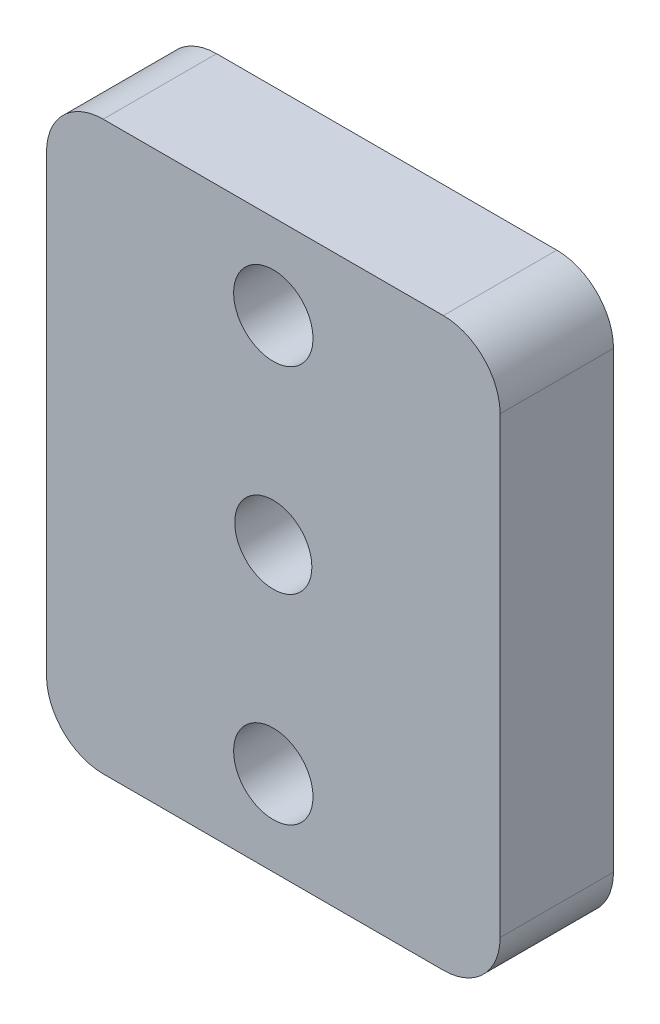
ISO-10303-21;
HEADER;
FILE_DESCRIPTION(('STEP AP214'),'2;1');
FILE_NAME('part.step','',(''),(''),'','','');
FILE_SCHEMA(('AUTOMOTIVE_DESIGN { 1 0 10303 214 1 1 1 1 }'));
ENDSEC;
DATA;
#1=APPLICATION_CONTEXT('core data for automotive mechanical design processes');
#2=APPLICATION_PROTOCOL_DEFINITION('international standard','automotive_design',2000,#1);
#3=PRODUCT_CONTEXT('',#1,'mechanical');
#4=PRODUCT('Part','Part','',(#3));
#5=PRODUCT_RELATED_PRODUCT_CATEGORY('part','',(#4));
#6=PRODUCT_DEFINITION_FORMATION('','',#4);
#7=PRODUCT_DEFINITION_CONTEXT('part definition',#1,'design');
#8=PRODUCT_DEFINITION('design','',#6,#7);
#9=PRODUCT_DEFINITION_SHAPE('','',#8);
#10=(LENGTH_UNIT() NAMED_UNIT(*) SI_UNIT(.MILLI.,.METRE.));
#11=(NAMED_UNIT(*) PLANE_ANGLE_UNIT() SI_UNIT($,.RADIAN.));
#12=(NAMED_UNIT(*) SI_UNIT($,.STERADIAN.) SOLID_ANGLE_UNIT());
#13=UNCERTAINTY_MEASURE_WITH_UNIT(LENGTH_MEASURE(1.E-05),#10,'distance_accuracy_value','');
#14=(GEOMETRIC_REPRESENTATION_CONTEXT(3) GLOBAL_UNCERTAINTY_ASSIGNED_CONTEXT((#13)) GLOBAL_UNIT_ASSIGNED_CONTEXT((#10,
#11,#12)) REPRESENTATION_CONTEXT('',''));
#15=CARTESIAN_POINT('',(0.,0.,0.));
#16=DIRECTION('',(0.,0.,1.));
#17=DIRECTION('',(1.,0.,0.));
#18=AXIS2_PLACEMENT_3D('',#15,#16,#17);
#19=CARTESIAN_POINT('',(0.,0.,10.));
#20=DIRECTION('',(1.,0.,0.));
#21=DIRECTION('',(0.,0.,-1.));
#22=AXIS2_PLACEMENT_3D('',#19,#20,#21);
#23=PLANE('',#22);
#24=DIRECTION('',(0.,-1.,0.));
#25=VECTOR('',#24,1.);
#26=CARTESIAN_POINT('',(0.,0.,0.));
#27=LINE('',#26,#25);
#28=CARTESIAN_POINT('',(0.,45.,0.));
#29=VERTEX_POINT('',#28);
#30=CARTESIAN_POINT('',(0.,5.,0.));
#31=VERTEX_POINT('',#30);
#32=EDGE_CURVE('E126',#29,#31,#27,.T.);
#33=ORIENTED_EDGE('',*,*,#32,.T.);
#34=DIRECTION('',(0.,0.,-1.));
#35=VECTOR('',#34,1.);
#36=CARTESIAN_POINT('',(0.,5.,10.));
#37=LINE('',#36,#35);
#38=CARTESIAN_POINT('',(0.,5.,10.));
#39=VERTEX_POINT('',#38);
#40=EDGE_CURVE('E104',#31,#39,#37,.F.);
#41=ORIENTED_EDGE('',*,*,#40,.T.);
#42=DIRECTION('',(0.,-1.,0.));
#43=VECTOR('',#42,1.);
#44=CARTESIAN_POINT('',(0.,0.,10.));
#45=LINE('',#44,#43);
#46=CARTESIAN_POINT('',(0.,45.,10.));
#47=VERTEX_POINT('',#46);
#48=EDGE_CURVE('E136',#47,#39,#45,.T.);
#49=ORIENTED_EDGE('',*,*,#48,.F.);
#50=DIRECTION('',(0.,0.,-1.));
#51=VECTOR('',#50,1.);
#52=CARTESIAN_POINT('',(0.,45.,10.));
#53=LINE('',#52,#51);
#54=EDGE_CURVE('E109',#47,#29,#53,.T.);
#55=ORIENTED_EDGE('',*,*,#54,.T.);
#56=EDGE_LOOP('',(#33,#41,#49,#55));
#57=FACE_BOUND('',#56,.T.);
#58=ADVANCED_FACE('F33',(#57),#23,.F.);
#59=CARTESIAN_POINT('',(0.,0.,10.));
#60=DIRECTION('',(0.,1.,0.));
#61=DIRECTION('',(0.,0.,1.));
#62=AXIS2_PLACEMENT_3D('',#59,#60,#61);
#63=PLANE('',#62);
#64=DIRECTION('',(1.,0.,0.));
#65=VECTOR('',#64,1.);
#66=CARTESIAN_POINT('',(0.,0.,10.));
#67=LINE('',#66,#65);
#68=CARTESIAN_POINT('',(5.,0.,10.));
#69=VERTEX_POINT('',#68);
#70=CARTESIAN_POINT('',(35.,0.,10.));
#71=VERTEX_POINT('',#70);
#72=EDGE_CURVE('E119',#69,#71,#67,.T.);
#73=ORIENTED_EDGE('',*,*,#72,.F.);
#74=DIRECTION('',(0.,0.,-1.));
#75=VECTOR('',#74,1.);
#76=CARTESIAN_POINT('',(5.,0.,10.));
#77=LINE('',#76,#75);
#78=CARTESIAN_POINT('',(5.,0.,0.));
#79=VERTEX_POINT('',#78);
#80=EDGE_CURVE('E103',#69,#79,#77,.T.);
#81=ORIENTED_EDGE('',*,*,#80,.T.);
#82=DIRECTION('',(1.,0.,0.));
#83=VECTOR('',#82,1.);
#84=CARTESIAN_POINT('',(0.,0.,0.));
#85=LINE('',#84,#83);
#86=CARTESIAN_POINT('',(35.,0.,0.));
#87=VERTEX_POINT('',#86);
#88=EDGE_CURVE('E116',#79,#87,#85,.T.);
#89=ORIENTED_EDGE('',*,*,#88,.T.);
#90=DIRECTION('',(0.,0.,-1.));
#91=VECTOR('',#90,1.);
#92=CARTESIAN_POINT('',(35.,0.,10.));
#93=LINE('',#92,#91);
#94=EDGE_CURVE('E121',#87,#71,#93,.F.);
#95=ORIENTED_EDGE('',*,*,#94,.T.);
#96=EDGE_LOOP('',(#73,#81,#89,#95));
#97=FACE_BOUND('',#96,.T.);
#98=ADVANCED_FACE('F115',(#97),#63,.F.);
#99=CARTESIAN_POINT('',(40.,0.,10.));
#100=DIRECTION('',(-1.,0.,0.));
#101=DIRECTION('',(0.,0.,1.));
#102=AXIS2_PLACEMENT_3D('',#99,#100,#101);
#103=PLANE('',#102);
#104=DIRECTION('',(0.,1.,0.));
#105=VECTOR('',#104,1.);
#106=CARTESIAN_POINT('',(40.,0.,10.));
#107=LINE('',#106,#105);
#108=CARTESIAN_POINT('',(40.,5.,10.));
#109=VERTEX_POINT('',#108);
#110=CARTESIAN_POINT('',(40.,45.,10.));
#111=VERTEX_POINT('',#110);
#112=EDGE_CURVE('E162',#109,#111,#107,.T.);
#113=ORIENTED_EDGE('',*,*,#112,.F.);
#114=DIRECTION('',(0.,0.,-1.));
#115=VECTOR('',#114,1.);
#116=CARTESIAN_POINT('',(40.,5.,10.));
#117=LINE('',#116,#115);
#118=CARTESIAN_POINT('',(40.,5.,0.));
#119=VERTEX_POINT('',#118);
#120=EDGE_CURVE('E155',#109,#119,#117,.T.);
#121=ORIENTED_EDGE('',*,*,#120,.T.);
#122=DIRECTION('',(0.,1.,0.));
#123=VECTOR('',#122,1.);
#124=CARTESIAN_POINT('',(40.,0.,0.));
#125=LINE('',#124,#123);
#126=CARTESIAN_POINT('',(40.,45.,0.));
#127=VERTEX_POINT('',#126);
#128=EDGE_CURVE('E125',#119,#127,#125,.T.);
#129=ORIENTED_EDGE('',*,*,#128,.T.);
#130=DIRECTION('',(0.,0.,-1.));
#131=VECTOR('',#130,1.);
#132=CARTESIAN_POINT('',(40.,45.,10.));
#133=LINE('',#132,#131);
#134=EDGE_CURVE('E153',#127,#111,#133,.F.);
#135=ORIENTED_EDGE('',*,*,#134,.T.);
#136=EDGE_LOOP('',(#113,#121,#129,#135));
#137=FACE_BOUND('',#136,.T.);
#138=ADVANCED_FACE('F160',(#137),#103,.F.);
#139=CARTESIAN_POINT('',(0.,50.,10.));
#140=DIRECTION('',(0.,-1.,0.));
#141=DIRECTION('',(0.,0.,-1.));
#142=AXIS2_PLACEMENT_3D('',#139,#140,#141);
#143=PLANE('',#142);
#144=DIRECTION('',(-1.,0.,0.));
#145=VECTOR('',#144,1.);
#146=CARTESIAN_POINT('',(0.,50.,10.));
#147=LINE('',#146,#145);
#148=CARTESIAN_POINT('',(35.,50.,10.));
#149=VERTEX_POINT('',#148);
#150=CARTESIAN_POINT('',(5.,50.,10.));
#151=VERTEX_POINT('',#150);
#152=EDGE_CURVE('E137',#149,#151,#147,.T.);
#153=ORIENTED_EDGE('',*,*,#152,.F.);
#154=DIRECTION('',(0.,0.,-1.));
#155=VECTOR('',#154,1.);
#156=CARTESIAN_POINT('',(35.,50.,10.));
#157=LINE('',#156,#155);
#158=CARTESIAN_POINT('',(35.,50.,0.));
#159=VERTEX_POINT('',#158);
#160=EDGE_CURVE('E11',#149,#159,#157,.T.);
#161=ORIENTED_EDGE('',*,*,#160,.T.);
#162=DIRECTION('',(-1.,0.,0.));
#163=VECTOR('',#162,1.);
#164=CARTESIAN_POINT('',(0.,50.,0.));
#165=LINE('',#164,#163);
#166=CARTESIAN_POINT('',(5.,50.,0.));
#167=VERTEX_POINT('',#166);
#168=EDGE_CURVE('E129',#159,#167,#165,.T.);
#169=ORIENTED_EDGE('',*,*,#168,.T.);
#170=DIRECTION('',(0.,0.,-1.));
#171=VECTOR('',#170,1.);
#172=CARTESIAN_POINT('',(5.,50.,10.));
#173=LINE('',#172,#171);
#174=EDGE_CURVE('E41',#167,#151,#173,.F.);
#175=ORIENTED_EDGE('',*,*,#174,.T.);
#176=EDGE_LOOP('',(#153,#161,#169,#175));
#177=FACE_BOUND('',#176,.T.);
#178=ADVANCED_FACE('F169',(#177),#143,.F.);
#179=CARTESIAN_POINT('',(0.,0.,10.));
#180=DIRECTION('',(0.,0.,-1.));
#181=DIRECTION('',(-1.,0.,0.));
#182=AXIS2_PLACEMENT_3D('',#179,#180,#181);
#183=PLANE('',#182);
#184=CARTESIAN_POINT('',(20.,7.5,10.));
#185=DIRECTION('',(0.,0.,-1.));
#186=DIRECTION('',(-1.,0.,0.));
#187=AXIS2_PLACEMENT_3D('',#184,#185,#186);
#188=CIRCLE('',#187,3.5);
#189=CARTESIAN_POINT('',(16.5,7.5,10.));
#190=VERTEX_POINT('',#189);
#191=EDGE_CURVE('E181',#190,#190,#188,.T.);
#192=ORIENTED_EDGE('',*,*,#191,.T.);
#193=EDGE_LOOP('',(#192));
#194=FACE_BOUND('',#193,.T.);
#195=CARTESIAN_POINT('',(20.,42.5,10.));
#196=DIRECTION('',(0.,0.,-1.));
#197=DIRECTION('',(-1.,0.,0.));
#198=AXIS2_PLACEMENT_3D('',#195,#196,#197);
#199=CIRCLE('',#198,3.5);
#200=CARTESIAN_POINT('',(16.5,42.5,10.));
#201=VERTEX_POINT('',#200);
#202=EDGE_CURVE('E184',#201,#201,#199,.T.);
#203=ORIENTED_EDGE('',*,*,#202,.T.);
#204=EDGE_LOOP('',(#203));
#205=FACE_BOUND('',#204,.T.);
#206=CARTESIAN_POINT('',(20.,25.,10.));
#207=DIRECTION('',(0.,0.,-1.));
#208=DIRECTION('',(-1.,0.,0.));
#209=AXIS2_PLACEMENT_3D('',#206,#207,#208);
#210=CIRCLE('',#209,3.4);
#211=CARTESIAN_POINT('',(16.6,25.,10.));
#212=VERTEX_POINT('',#211);
#213=EDGE_CURVE('E131',#212,#212,#210,.T.);
#214=ORIENTED_EDGE('',*,*,#213,.T.);
#215=EDGE_LOOP('',(#214));
#216=FACE_BOUND('',#215,.T.);
#217=ORIENTED_EDGE('',*,*,#48,.T.);
#218=CARTESIAN_POINT('',(5.,5.,10.));
#219=DIRECTION('',(0.,0.,-1.));
#220=DIRECTION('',(-1.,0.,0.));
#221=AXIS2_PLACEMENT_3D('',#218,#219,#220);
#222=CIRCLE('',#221,5.);
#223=EDGE_CURVE('E151',#39,#69,#222,.F.);
#224=ORIENTED_EDGE('',*,*,#223,.T.);
#225=ORIENTED_EDGE('',*,*,#72,.T.);
#226=CARTESIAN_POINT('',(35.,5.,10.));
#227=DIRECTION('',(0.,0.,-1.));
#228=DIRECTION('',(-1.,0.,0.));
#229=AXIS2_PLACEMENT_3D('',#226,#227,#228);
#230=CIRCLE('',#229,5.);
#231=EDGE_CURVE('E149',#71,#109,#230,.F.);
#232=ORIENTED_EDGE('',*,*,#231,.T.);
#233=ORIENTED_EDGE('',*,*,#112,.T.);
#234=CARTESIAN_POINT('',(35.,45.,10.));
#235=DIRECTION('',(0.,0.,-1.));
#236=DIRECTION('',(-1.,0.,0.));
#237=AXIS2_PLACEMENT_3D('',#234,#235,#236);
#238=CIRCLE('',#237,5.);
#239=EDGE_CURVE('E54',#111,#149,#238,.F.);
#240=ORIENTED_EDGE('',*,*,#239,.T.);
#241=ORIENTED_EDGE('',*,*,#152,.T.);
#242=CARTESIAN_POINT('',(5.,45.,10.));
#243=DIRECTION('',(0.,0.,-1.));
#244=DIRECTION('',(-1.,0.,0.));
#245=AXIS2_PLACEMENT_3D('',#242,#243,#244);
#246=CIRCLE('',#245,5.);
#247=EDGE_CURVE('E146',#151,#47,#246,.F.);
#248=ORIENTED_EDGE('',*,*,#247,.T.);
#249=EDGE_LOOP('',(#217,#224,#225,#232,#233,#240,#241,#248));
#250=FACE_BOUND('',#249,.T.);
#251=ADVANCED_FACE('F203',(#194,#205,#216,#250),#183,.F.);
#252=CARTESIAN_POINT('',(0.,0.,0.));
#253=DIRECTION('',(0.,0.,-1.));
#254=DIRECTION('',(-1.,0.,0.));
#255=AXIS2_PLACEMENT_3D('',#252,#253,#254);
#256=PLANE('',#255);
#257=CARTESIAN_POINT('',(20.,7.5,0.));
#258=DIRECTION('',(0.,0.,1.));
#259=DIRECTION('',(1.,0.,0.));
#260=AXIS2_PLACEMENT_3D('',#257,#258,#259);
#261=CIRCLE('',#260,3.5);
#262=CARTESIAN_POINT('',(23.5,7.5,0.));
#263=VERTEX_POINT('',#262);
#264=EDGE_CURVE('E187',#263,#263,#261,.T.);
#265=ORIENTED_EDGE('',*,*,#264,.T.);
#266=EDGE_LOOP('',(#265));
#267=FACE_BOUND('',#266,.T.);
#268=CARTESIAN_POINT('',(20.,42.5,0.));
#269=DIRECTION('',(0.,0.,1.));
#270=DIRECTION('',(-1.,0.,0.));
#271=AXIS2_PLACEMENT_3D('',#268,#269,#270);
#272=CIRCLE('',#271,3.5);
#273=CARTESIAN_POINT('',(16.5,42.5,0.));
#274=VERTEX_POINT('',#273);
#275=EDGE_CURVE('E188',#274,#274,#272,.T.);
#276=ORIENTED_EDGE('',*,*,#275,.T.);
#277=EDGE_LOOP('',(#276));
#278=FACE_BOUND('',#277,.T.);
#279=CARTESIAN_POINT('',(20.,25.,0.));
#280=DIRECTION('',(0.,0.,1.));
#281=DIRECTION('',(1.,0.,0.));
#282=AXIS2_PLACEMENT_3D('',#279,#280,#281);
#283=CIRCLE('',#282,3.4);
#284=CARTESIAN_POINT('',(23.4,25.,0.));
#285=VERTEX_POINT('',#284);
#286=EDGE_CURVE('E178',#285,#285,#283,.T.);
#287=ORIENTED_EDGE('',*,*,#286,.T.);
#288=EDGE_LOOP('',(#287));
#289=FACE_BOUND('',#288,.T.);
#290=ORIENTED_EDGE('',*,*,#88,.F.);
#291=CARTESIAN_POINT('',(5.,5.,0.));
#292=DIRECTION('',(0.,0.,-1.));
#293=DIRECTION('',(-1.,0.,0.));
#294=AXIS2_PLACEMENT_3D('',#291,#292,#293);
#295=CIRCLE('',#294,5.);
#296=EDGE_CURVE('E99',#79,#31,#295,.T.);
#297=ORIENTED_EDGE('',*,*,#296,.T.);
#298=ORIENTED_EDGE('',*,*,#32,.F.);
#299=CARTESIAN_POINT('',(5.,45.,0.));
#300=DIRECTION('',(0.,0.,-1.));
#301=DIRECTION('',(-1.,0.,0.));
#302=AXIS2_PLACEMENT_3D('',#299,#300,#301);
#303=CIRCLE('',#302,5.);
#304=EDGE_CURVE('E120',#29,#167,#303,.T.);
#305=ORIENTED_EDGE('',*,*,#304,.T.);
#306=ORIENTED_EDGE('',*,*,#168,.F.);
#307=CARTESIAN_POINT('',(35.,45.,0.));
#308=DIRECTION('',(0.,0.,-1.));
#309=DIRECTION('',(-1.,0.,0.));
#310=AXIS2_PLACEMENT_3D('',#307,#308,#309);
#311=CIRCLE('',#310,5.);
#312=EDGE_CURVE('E140',#159,#127,#311,.T.);
#313=ORIENTED_EDGE('',*,*,#312,.T.);
#314=ORIENTED_EDGE('',*,*,#128,.F.);
#315=CARTESIAN_POINT('',(35.,5.,0.));
#316=DIRECTION('',(0.,0.,-1.));
#317=DIRECTION('',(-1.,0.,0.));
#318=AXIS2_PLACEMENT_3D('',#315,#316,#317);
#319=CIRCLE('',#318,5.);
#320=EDGE_CURVE('E110',#119,#87,#319,.T.);
#321=ORIENTED_EDGE('',*,*,#320,.T.);
#322=EDGE_LOOP('',(#290,#297,#298,#305,#306,#313,#314,#321));
#323=FACE_BOUND('',#322,.T.);
#324=ADVANCED_FACE('F123',(#267,#278,#289,#323),#256,.T.);
#325=CARTESIAN_POINT('',(20.,25.,0.));
#326=DIRECTION('',(0.,0.,1.));
#327=DIRECTION('',(1.,0.,0.));
#328=AXIS2_PLACEMENT_3D('',#325,#326,#327);
#329=CYLINDRICAL_SURFACE('',#328,3.4);
#330=ORIENTED_EDGE('',*,*,#286,.F.);
#331=EDGE_LOOP('',(#330));
#332=FACE_BOUND('',#331,.T.);
#333=ORIENTED_EDGE('',*,*,#213,.F.);
#334=EDGE_LOOP('',(#333));
#335=FACE_BOUND('',#334,.T.);
#336=ADVANCED_FACE('F264',(#332,#335),#329,.F.);
#337=CARTESIAN_POINT('',(20.,42.5,0.));
#338=DIRECTION('',(0.,0.,1.));
#339=DIRECTION('',(1.,0.,0.));
#340=AXIS2_PLACEMENT_3D('',#337,#338,#339);
#341=CYLINDRICAL_SURFACE('',#340,3.5);
#342=ORIENTED_EDGE('',*,*,#275,.F.);
#343=EDGE_LOOP('',(#342));
#344=FACE_BOUND('',#343,.T.);
#345=ORIENTED_EDGE('',*,*,#202,.F.);
#346=EDGE_LOOP('',(#345));
#347=FACE_BOUND('',#346,.T.);
#348=ADVANCED_FACE('F199',(#344,#347),#341,.F.);
#349=CARTESIAN_POINT('',(20.,7.5,0.));
#350=DIRECTION('',(0.,0.,1.));
#351=DIRECTION('',(1.,0.,0.));
#352=AXIS2_PLACEMENT_3D('',#349,#350,#351);
#353=CYLINDRICAL_SURFACE('',#352,3.5);
#354=ORIENTED_EDGE('',*,*,#264,.F.);
#355=EDGE_LOOP('',(#354));
#356=FACE_BOUND('',#355,.T.);
#357=ORIENTED_EDGE('',*,*,#191,.F.);
#358=EDGE_LOOP('',(#357));
#359=FACE_BOUND('',#358,.T.);
#360=ADVANCED_FACE('F196',(#356,#359),#353,.F.);
#361=CARTESIAN_POINT('',(5.,5.,10.));
#362=DIRECTION('',(0.,0.,-1.));
#363=DIRECTION('',(-1.,0.,0.));
#364=AXIS2_PLACEMENT_3D('',#361,#362,#363);
#365=CYLINDRICAL_SURFACE('',#364,5.);
#366=ORIENTED_EDGE('',*,*,#223,.F.);
#367=ORIENTED_EDGE('',*,*,#40,.F.);
#368=ORIENTED_EDGE('',*,*,#296,.F.);
#369=ORIENTED_EDGE('',*,*,#80,.F.);
#370=EDGE_LOOP('',(#366,#367,#368,#369));
#371=FACE_BOUND('',#370,.T.);
#372=ADVANCED_FACE('F102',(#371),#365,.T.);
#373=CARTESIAN_POINT('',(35.,5.,10.));
#374=DIRECTION('',(0.,0.,-1.));
#375=DIRECTION('',(-1.,0.,0.));
#376=AXIS2_PLACEMENT_3D('',#373,#374,#375);
#377=CYLINDRICAL_SURFACE('',#376,5.);
#378=ORIENTED_EDGE('',*,*,#231,.F.);
#379=ORIENTED_EDGE('',*,*,#94,.F.);
#380=ORIENTED_EDGE('',*,*,#320,.F.);
#381=ORIENTED_EDGE('',*,*,#120,.F.);
#382=EDGE_LOOP('',(#378,#379,#380,#381));
#383=FACE_BOUND('',#382,.T.);
#384=ADVANCED_FACE('F218',(#383),#377,.T.);
#385=CARTESIAN_POINT('',(35.,45.,10.));
#386=DIRECTION('',(0.,0.,-1.));
#387=DIRECTION('',(-1.,0.,0.));
#388=AXIS2_PLACEMENT_3D('',#385,#386,#387);
#389=CYLINDRICAL_SURFACE('',#388,5.);
#390=ORIENTED_EDGE('',*,*,#239,.F.);
#391=ORIENTED_EDGE('',*,*,#134,.F.);
#392=ORIENTED_EDGE('',*,*,#312,.F.);
#393=ORIENTED_EDGE('',*,*,#160,.F.);
#394=EDGE_LOOP('',(#390,#391,#392,#393));
#395=FACE_BOUND('',#394,.T.);
#396=ADVANCED_FACE('F168',(#395),#389,.T.);
#397=CARTESIAN_POINT('',(5.,45.,10.));
#398=DIRECTION('',(0.,0.,-1.));
#399=DIRECTION('',(-1.,0.,0.));
#400=AXIS2_PLACEMENT_3D('',#397,#398,#399);
#401=CYLINDRICAL_SURFACE('',#400,5.);
#402=ORIENTED_EDGE('',*,*,#247,.F.);
#403=ORIENTED_EDGE('',*,*,#174,.F.);
#404=ORIENTED_EDGE('',*,*,#304,.F.);
#405=ORIENTED_EDGE('',*,*,#54,.F.);
#406=EDGE_LOOP('',(#402,#403,#404,#405));
#407=FACE_BOUND('',#406,.T.);
#408=ADVANCED_FACE('F35',(#407),#401,.T.);
#409=CLOSED_SHELL('',(#58,#98,#138,#178,#251,#324,#336,#348,#360,#372,#384,#396,#408));
#410=MANIFOLD_SOLID_BREP('B2',#409);
#411=ADVANCED_BREP_SHAPE_REPRESENTATION('',(#18,#410),#14);
#412=SHAPE_DEFINITION_REPRESENTATION(#9,#411);
ENDSEC;
END-ISO-10303-21;
